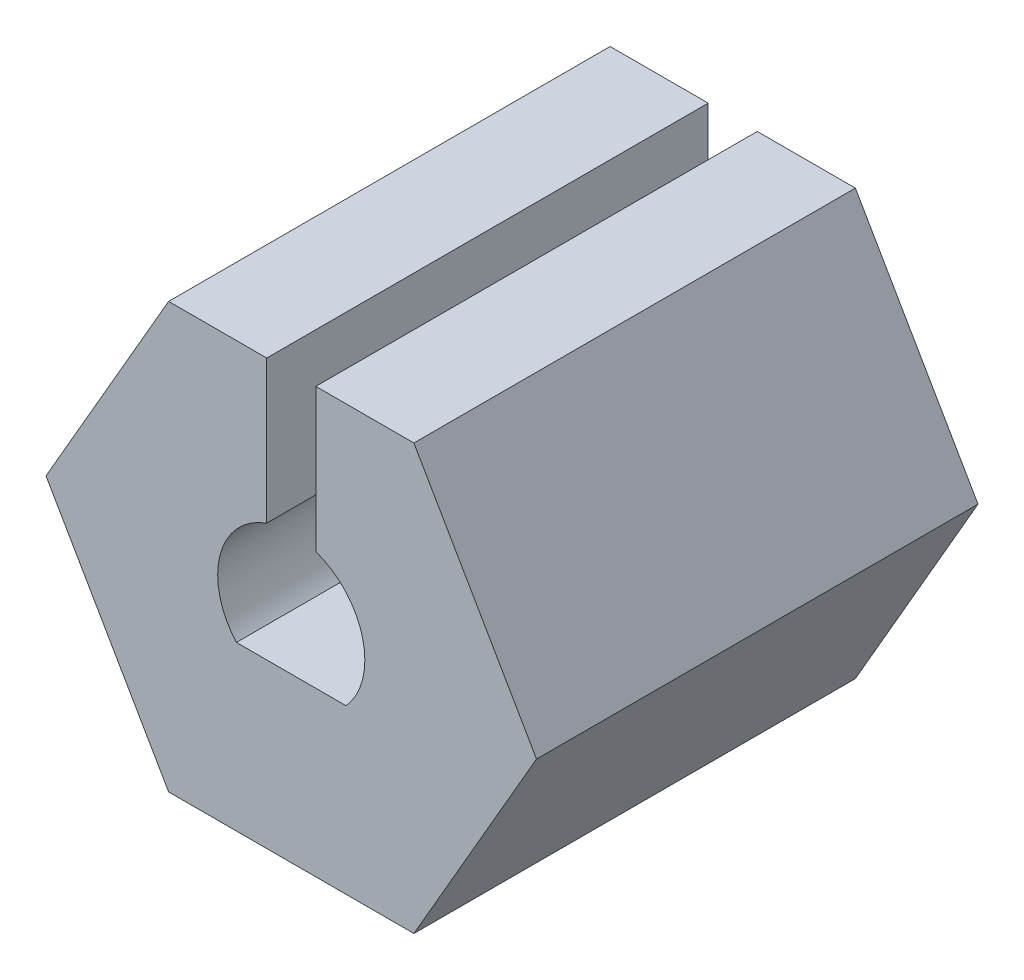
ISO-10303-21;
HEADER;
FILE_DESCRIPTION(('STEP AP214'),'2;1');
FILE_NAME('part.step','',(''),(''),'','','');
FILE_SCHEMA(('AUTOMOTIVE_DESIGN { 1 0 10303 214 1 1 1 1 }'));
ENDSEC;
DATA;
#1=APPLICATION_CONTEXT('core data for automotive mechanical design processes');
#2=APPLICATION_PROTOCOL_DEFINITION('international standard','automotive_design',2000,#1);
#3=PRODUCT_CONTEXT('',#1,'mechanical');
#4=PRODUCT('Part','Part','',(#3));
#5=PRODUCT_RELATED_PRODUCT_CATEGORY('part','',(#4));
#6=PRODUCT_DEFINITION_FORMATION('','',#4);
#7=PRODUCT_DEFINITION_CONTEXT('part definition',#1,'design');
#8=PRODUCT_DEFINITION('design','',#6,#7);
#9=PRODUCT_DEFINITION_SHAPE('','',#8);
#10=(LENGTH_UNIT() NAMED_UNIT(*) SI_UNIT(.MILLI.,.METRE.));
#11=(NAMED_UNIT(*) PLANE_ANGLE_UNIT() SI_UNIT($,.RADIAN.));
#12=(NAMED_UNIT(*) SI_UNIT($,.STERADIAN.) SOLID_ANGLE_UNIT());
#13=UNCERTAINTY_MEASURE_WITH_UNIT(LENGTH_MEASURE(1.E-05),#10,'distance_accuracy_value','');
#14=(GEOMETRIC_REPRESENTATION_CONTEXT(3) GLOBAL_UNCERTAINTY_ASSIGNED_CONTEXT((#13)) GLOBAL_UNIT_ASSIGNED_CONTEXT((#10,
#11,#12)) REPRESENTATION_CONTEXT('',''));
#15=CARTESIAN_POINT('',(0.,0.,0.));
#16=DIRECTION('',(0.,0.,1.));
#17=DIRECTION('',(1.,0.,0.));
#18=AXIS2_PLACEMENT_3D('',#15,#16,#17);
#19=CARTESIAN_POINT('',(0.,0.,9.));
#20=DIRECTION('',(0.,0.,-1.));
#21=DIRECTION('',(-1.,0.,0.));
#22=AXIS2_PLACEMENT_3D('',#19,#20,#21);
#23=CYLINDRICAL_SURFACE('',#22,1.5);
#24=CARTESIAN_POINT('',(0.,0.,0.));
#25=DIRECTION('',(0.,0.,1.));
#26=DIRECTION('',(1.,0.,0.));
#27=AXIS2_PLACEMENT_3D('',#24,#25,#26);
#28=CIRCLE('',#27,1.5);
#29=CARTESIAN_POINT('',(-0.499999999999999,1.4142135623731,0.));
#30=VERTEX_POINT('',#29);
#31=CARTESIAN_POINT('',(-1.1180339887499,-1.,0.));
#32=VERTEX_POINT('',#31);
#33=EDGE_CURVE('E162',#30,#32,#28,.T.);
#34=ORIENTED_EDGE('',*,*,#33,.F.);
#35=DIRECTION('',(0.,0.,-1.));
#36=VECTOR('',#35,1.);
#37=CARTESIAN_POINT('',(-0.499999999999999,1.4142135623731,9.));
#38=LINE('',#37,#36);
#39=CARTESIAN_POINT('',(-0.499999999999999,1.4142135623731,9.));
#40=VERTEX_POINT('',#39);
#41=EDGE_CURVE('E11',#40,#30,#38,.T.);
#42=ORIENTED_EDGE('',*,*,#41,.F.);
#43=CARTESIAN_POINT('',(0.,0.,9.));
#44=DIRECTION('',(0.,0.,1.));
#45=DIRECTION('',(1.,0.,0.));
#46=AXIS2_PLACEMENT_3D('',#43,#44,#45);
#47=CIRCLE('',#46,1.5);
#48=CARTESIAN_POINT('',(-1.1180339887499,-1.,9.));
#49=VERTEX_POINT('',#48);
#50=EDGE_CURVE('E150',#40,#49,#47,.T.);
#51=ORIENTED_EDGE('',*,*,#50,.T.);
#52=DIRECTION('',(0.,0.,-1.));
#53=VECTOR('',#52,1.);
#54=CARTESIAN_POINT('',(-1.1180339887499,-1.,9.));
#55=LINE('',#54,#53);
#56=EDGE_CURVE('E52',#49,#32,#55,.T.);
#57=ORIENTED_EDGE('',*,*,#56,.T.);
#58=EDGE_LOOP('',(#34,#42,#51,#57));
#59=FACE_BOUND('',#58,.T.);
#60=ADVANCED_FACE('F35',(#59),#23,.F.);
#61=CARTESIAN_POINT('',(-0.499999999999999,0.,9.));
#62=DIRECTION('',(1.,0.,0.));
#63=DIRECTION('',(0.,1.,0.));
#64=AXIS2_PLACEMENT_3D('',#61,#62,#63);
#65=PLANE('',#64);
#66=DIRECTION('',(0.,-1.,0.));
#67=VECTOR('',#66,1.);
#68=CARTESIAN_POINT('',(-0.499999999999999,0.,0.));
#69=LINE('',#68,#67);
#70=CARTESIAN_POINT('',(-0.5,4.33012701892219,0.));
#71=VERTEX_POINT('',#70);
#72=EDGE_CURVE('E198',#71,#30,#69,.T.);
#73=ORIENTED_EDGE('',*,*,#72,.F.);
#74=DIRECTION('',(0.,0.,-1.));
#75=VECTOR('',#74,1.);
#76=CARTESIAN_POINT('',(-0.5,4.33012701892219,9.));
#77=LINE('',#76,#75);
#78=CARTESIAN_POINT('',(-0.5,4.33012701892219,9.));
#79=VERTEX_POINT('',#78);
#80=EDGE_CURVE('E44',#79,#71,#77,.T.);
#81=ORIENTED_EDGE('',*,*,#80,.F.);
#82=DIRECTION('',(0.,-1.,0.));
#83=VECTOR('',#82,1.);
#84=CARTESIAN_POINT('',(-0.499999999999999,0.,9.));
#85=LINE('',#84,#83);
#86=EDGE_CURVE('E153',#79,#40,#85,.T.);
#87=ORIENTED_EDGE('',*,*,#86,.T.);
#88=ORIENTED_EDGE('',*,*,#41,.T.);
#89=EDGE_LOOP('',(#73,#81,#87,#88));
#90=FACE_BOUND('',#89,.T.);
#91=ADVANCED_FACE('F37',(#90),#65,.T.);
#92=CARTESIAN_POINT('',(0.,4.33012701892219,9.));
#93=DIRECTION('',(0.,-1.,0.));
#94=DIRECTION('',(1.,0.,0.));
#95=AXIS2_PLACEMENT_3D('',#92,#93,#94);
#96=PLANE('',#95);
#97=DIRECTION('',(-1.,0.,0.));
#98=VECTOR('',#97,1.);
#99=CARTESIAN_POINT('',(0.,4.33012701892219,0.));
#100=LINE('',#99,#98);
#101=CARTESIAN_POINT('',(-2.50000000000002,4.33012701892218,0.));
#102=VERTEX_POINT('',#101);
#103=EDGE_CURVE('E191',#71,#102,#100,.T.);
#104=ORIENTED_EDGE('',*,*,#103,.T.);
#105=DIRECTION('',(0.,0.,-1.));
#106=VECTOR('',#105,1.);
#107=CARTESIAN_POINT('',(-2.50000000000002,4.33012701892218,9.));
#108=LINE('',#107,#106);
#109=CARTESIAN_POINT('',(-2.50000000000002,4.33012701892218,9.));
#110=VERTEX_POINT('',#109);
#111=EDGE_CURVE('E184',#110,#102,#108,.T.);
#112=ORIENTED_EDGE('',*,*,#111,.F.);
#113=DIRECTION('',(-1.,0.,0.));
#114=VECTOR('',#113,1.);
#115=CARTESIAN_POINT('',(0.,4.33012701892219,9.));
#116=LINE('',#115,#114);
#117=EDGE_CURVE('E156',#79,#110,#116,.T.);
#118=ORIENTED_EDGE('',*,*,#117,.F.);
#119=ORIENTED_EDGE('',*,*,#80,.T.);
#120=EDGE_LOOP('',(#104,#112,#118,#119));
#121=FACE_BOUND('',#120,.T.);
#122=ADVANCED_FACE('F189',(#121),#96,.F.);
#123=CARTESIAN_POINT('',(-3.75000000000001,2.16506350946107,9.));
#124=DIRECTION('',(0.866025403784441,-0.499999999999995,0.));
#125=DIRECTION('',(0.499999999999995,0.866025403784442,0.));
#126=AXIS2_PLACEMENT_3D('',#123,#124,#125);
#127=PLANE('',#126);
#128=DIRECTION('',(-0.499999999999995,-0.866025403784442,0.));
#129=VECTOR('',#128,1.);
#130=CARTESIAN_POINT('',(-3.75000000000001,2.16506350946107,0.));
#131=LINE('',#130,#129);
#132=CARTESIAN_POINT('',(-5.,0.,0.));
#133=VERTEX_POINT('',#132);
#134=EDGE_CURVE('E200',#102,#133,#131,.T.);
#135=ORIENTED_EDGE('',*,*,#134,.T.);
#136=DIRECTION('',(0.,0.,-1.));
#137=VECTOR('',#136,1.);
#138=CARTESIAN_POINT('',(-5.,0.,9.));
#139=LINE('',#138,#137);
#140=CARTESIAN_POINT('',(-5.,0.,9.));
#141=VERTEX_POINT('',#140);
#142=EDGE_CURVE('E181',#141,#133,#139,.T.);
#143=ORIENTED_EDGE('',*,*,#142,.F.);
#144=DIRECTION('',(-0.499999999999995,-0.866025403784442,0.));
#145=VECTOR('',#144,1.);
#146=CARTESIAN_POINT('',(-3.75000000000001,2.16506350946107,9.));
#147=LINE('',#146,#145);
#148=EDGE_CURVE('E237',#110,#141,#147,.T.);
#149=ORIENTED_EDGE('',*,*,#148,.F.);
#150=ORIENTED_EDGE('',*,*,#111,.T.);
#151=EDGE_LOOP('',(#135,#143,#149,#150));
#152=FACE_BOUND('',#151,.T.);
#153=ADVANCED_FACE('F241',(#152),#127,.F.);
#154=CARTESIAN_POINT('',(-3.74999999999998,-2.16506350946113,9.));
#155=DIRECTION('',(0.866025403784435,0.500000000000007,0.));
#156=DIRECTION('',(-0.500000000000007,0.866025403784435,0.));
#157=AXIS2_PLACEMENT_3D('',#154,#155,#156);
#158=PLANE('',#157);
#159=DIRECTION('',(0.500000000000007,-0.866025403784435,0.));
#160=VECTOR('',#159,1.);
#161=CARTESIAN_POINT('',(-3.74999999999998,-2.16506350946113,0.));
#162=LINE('',#161,#160);
#163=CARTESIAN_POINT('',(-2.49999999999996,-4.33012701892222,0.));
#164=VERTEX_POINT('',#163);
#165=EDGE_CURVE('E206',#133,#164,#162,.T.);
#166=ORIENTED_EDGE('',*,*,#165,.T.);
#167=DIRECTION('',(0.,0.,-1.));
#168=VECTOR('',#167,1.);
#169=CARTESIAN_POINT('',(-2.49999999999996,-4.33012701892222,9.));
#170=LINE('',#169,#168);
#171=CARTESIAN_POINT('',(-2.49999999999996,-4.33012701892222,9.));
#172=VERTEX_POINT('',#171);
#173=EDGE_CURVE('E178',#172,#164,#170,.T.);
#174=ORIENTED_EDGE('',*,*,#173,.F.);
#175=DIRECTION('',(0.500000000000007,-0.866025403784435,0.));
#176=VECTOR('',#175,1.);
#177=CARTESIAN_POINT('',(-3.74999999999998,-2.16506350946113,9.));
#178=LINE('',#177,#176);
#179=EDGE_CURVE('E235',#141,#172,#178,.T.);
#180=ORIENTED_EDGE('',*,*,#179,.F.);
#181=ORIENTED_EDGE('',*,*,#142,.T.);
#182=EDGE_LOOP('',(#166,#174,#180,#181));
#183=FACE_BOUND('',#182,.T.);
#184=ADVANCED_FACE('F245',(#183),#158,.F.);
#185=CARTESIAN_POINT('',(0.,-4.33012701892219,9.));
#186=DIRECTION('',(0.,1.,0.));
#187=DIRECTION('',(-1.,0.,0.));
#188=AXIS2_PLACEMENT_3D('',#185,#186,#187);
#189=PLANE('',#188);
#190=DIRECTION('',(1.,0.,0.));
#191=VECTOR('',#190,1.);
#192=CARTESIAN_POINT('',(0.,-4.33012701892219,0.));
#193=LINE('',#192,#191);
#194=CARTESIAN_POINT('',(2.50000000000005,-4.33012701892216,0.));
#195=VERTEX_POINT('',#194);
#196=EDGE_CURVE('E208',#164,#195,#193,.T.);
#197=ORIENTED_EDGE('',*,*,#196,.T.);
#198=DIRECTION('',(0.,0.,-1.));
#199=VECTOR('',#198,1.);
#200=CARTESIAN_POINT('',(2.50000000000005,-4.33012701892216,9.));
#201=LINE('',#200,#199);
#202=CARTESIAN_POINT('',(2.50000000000005,-4.33012701892216,9.));
#203=VERTEX_POINT('',#202);
#204=EDGE_CURVE('E175',#203,#195,#201,.T.);
#205=ORIENTED_EDGE('',*,*,#204,.F.);
#206=DIRECTION('',(1.,0.,0.));
#207=VECTOR('',#206,1.);
#208=CARTESIAN_POINT('',(0.,-4.33012701892219,9.));
#209=LINE('',#208,#207);
#210=EDGE_CURVE('E231',#172,#203,#209,.T.);
#211=ORIENTED_EDGE('',*,*,#210,.F.);
#212=ORIENTED_EDGE('',*,*,#173,.T.);
#213=EDGE_LOOP('',(#197,#205,#211,#212));
#214=FACE_BOUND('',#213,.T.);
#215=ADVANCED_FACE('F248',(#214),#189,.F.);
#216=CARTESIAN_POINT('',(3.75000000000003,-2.16506350946108,9.));
#217=DIRECTION('',(-0.866025403784442,0.499999999999995,0.));
#218=DIRECTION('',(-0.499999999999995,-0.866025403784442,0.));
#219=AXIS2_PLACEMENT_3D('',#216,#217,#218);
#220=PLANE('',#219);
#221=DIRECTION('',(0.499999999999995,0.866025403784442,0.));
#222=VECTOR('',#221,1.);
#223=CARTESIAN_POINT('',(3.75000000000003,-2.16506350946108,0.));
#224=LINE('',#223,#222);
#225=CARTESIAN_POINT('',(5.,0.,0.));
#226=VERTEX_POINT('',#225);
#227=EDGE_CURVE('E210',#195,#226,#224,.T.);
#228=ORIENTED_EDGE('',*,*,#227,.T.);
#229=DIRECTION('',(0.,0.,-1.));
#230=VECTOR('',#229,1.);
#231=CARTESIAN_POINT('',(5.,0.,9.));
#232=LINE('',#231,#230);
#233=CARTESIAN_POINT('',(5.,0.,9.));
#234=VERTEX_POINT('',#233);
#235=EDGE_CURVE('E172',#234,#226,#232,.T.);
#236=ORIENTED_EDGE('',*,*,#235,.F.);
#237=DIRECTION('',(0.499999999999995,0.866025403784442,0.));
#238=VECTOR('',#237,1.);
#239=CARTESIAN_POINT('',(3.75000000000003,-2.16506350946108,9.));
#240=LINE('',#239,#238);
#241=EDGE_CURVE('E228',#203,#234,#240,.T.);
#242=ORIENTED_EDGE('',*,*,#241,.F.);
#243=ORIENTED_EDGE('',*,*,#204,.T.);
#244=EDGE_LOOP('',(#228,#236,#242,#243));
#245=FACE_BOUND('',#244,.T.);
#246=ADVANCED_FACE('F222',(#245),#220,.F.);
#247=CARTESIAN_POINT('',(3.75,2.1650635094611,9.));
#248=DIRECTION('',(-0.866025403784438,-0.500000000000001,0.));
#249=DIRECTION('',(0.500000000000001,-0.866025403784438,0.));
#250=AXIS2_PLACEMENT_3D('',#247,#248,#249);
#251=PLANE('',#250);
#252=DIRECTION('',(-0.500000000000001,0.866025403784438,0.));
#253=VECTOR('',#252,1.);
#254=CARTESIAN_POINT('',(3.75,2.1650635094611,0.));
#255=LINE('',#254,#253);
#256=CARTESIAN_POINT('',(2.49999999999999,4.3301270189222,0.));
#257=VERTEX_POINT('',#256);
#258=EDGE_CURVE('E211',#226,#257,#255,.T.);
#259=ORIENTED_EDGE('',*,*,#258,.T.);
#260=DIRECTION('',(0.,0.,-1.));
#261=VECTOR('',#260,1.);
#262=CARTESIAN_POINT('',(2.49999999999999,4.3301270189222,9.));
#263=LINE('',#262,#261);
#264=CARTESIAN_POINT('',(2.49999999999999,4.3301270189222,9.));
#265=VERTEX_POINT('',#264);
#266=EDGE_CURVE('E169',#265,#257,#263,.T.);
#267=ORIENTED_EDGE('',*,*,#266,.F.);
#268=DIRECTION('',(-0.500000000000001,0.866025403784438,0.));
#269=VECTOR('',#268,1.);
#270=CARTESIAN_POINT('',(3.75,2.1650635094611,9.));
#271=LINE('',#270,#269);
#272=EDGE_CURVE('E227',#234,#265,#271,.T.);
#273=ORIENTED_EDGE('',*,*,#272,.F.);
#274=ORIENTED_EDGE('',*,*,#235,.T.);
#275=EDGE_LOOP('',(#259,#267,#273,#274));
#276=FACE_BOUND('',#275,.T.);
#277=ADVANCED_FACE('F226',(#276),#251,.F.);
#278=CARTESIAN_POINT('',(0.5,4.33012701892219,0.));
#279=VERTEX_POINT('',#278);
#280=EDGE_CURVE('E202',#257,#279,#100,.T.);
#281=ORIENTED_EDGE('',*,*,#280,.T.);
#282=DIRECTION('',(0.,0.,-1.));
#283=VECTOR('',#282,1.);
#284=CARTESIAN_POINT('',(0.5,4.33012701892219,9.));
#285=LINE('',#284,#283);
#286=CARTESIAN_POINT('',(0.5,4.33012701892219,9.));
#287=VERTEX_POINT('',#286);
#288=EDGE_CURVE('E145',#287,#279,#285,.T.);
#289=ORIENTED_EDGE('',*,*,#288,.F.);
#290=EDGE_CURVE('E133',#265,#287,#116,.T.);
#291=ORIENTED_EDGE('',*,*,#290,.F.);
#292=ORIENTED_EDGE('',*,*,#266,.T.);
#293=EDGE_LOOP('',(#281,#289,#291,#292));
#294=FACE_BOUND('',#293,.T.);
#295=ADVANCED_FACE('F217',(#294),#96,.F.);
#296=CARTESIAN_POINT('',(0.500000000000001,0.,9.));
#297=DIRECTION('',(1.,0.,0.));
#298=DIRECTION('',(0.,1.,0.));
#299=AXIS2_PLACEMENT_3D('',#296,#297,#298);
#300=PLANE('',#299);
#301=DIRECTION('',(0.,-1.,0.));
#302=VECTOR('',#301,1.);
#303=CARTESIAN_POINT('',(0.500000000000001,0.,0.));
#304=LINE('',#303,#302);
#305=CARTESIAN_POINT('',(0.5,1.4142135623731,0.));
#306=VERTEX_POINT('',#305);
#307=EDGE_CURVE('E142',#279,#306,#304,.T.);
#308=ORIENTED_EDGE('',*,*,#307,.T.);
#309=DIRECTION('',(0.,0.,-1.));
#310=VECTOR('',#309,1.);
#311=CARTESIAN_POINT('',(0.5,1.4142135623731,9.));
#312=LINE('',#311,#310);
#313=CARTESIAN_POINT('',(0.5,1.4142135623731,9.));
#314=VERTEX_POINT('',#313);
#315=EDGE_CURVE('E139',#314,#306,#312,.T.);
#316=ORIENTED_EDGE('',*,*,#315,.F.);
#317=DIRECTION('',(0.,-1.,0.));
#318=VECTOR('',#317,1.);
#319=CARTESIAN_POINT('',(0.500000000000001,0.,9.));
#320=LINE('',#319,#318);
#321=EDGE_CURVE('E126',#287,#314,#320,.T.);
#322=ORIENTED_EDGE('',*,*,#321,.F.);
#323=ORIENTED_EDGE('',*,*,#288,.T.);
#324=EDGE_LOOP('',(#308,#316,#322,#323));
#325=FACE_BOUND('',#324,.T.);
#326=ADVANCED_FACE('F140',(#325),#300,.F.);
#327=CARTESIAN_POINT('',(1.1180339887499,-1.,0.));
#328=VERTEX_POINT('',#327);
#329=EDGE_CURVE('E158',#328,#306,#28,.T.);
#330=ORIENTED_EDGE('',*,*,#329,.F.);
#331=DIRECTION('',(0.,0.,-1.));
#332=VECTOR('',#331,1.);
#333=CARTESIAN_POINT('',(1.1180339887499,-1.,9.));
#334=LINE('',#333,#332);
#335=CARTESIAN_POINT('',(1.1180339887499,-1.,9.));
#336=VERTEX_POINT('',#335);
#337=EDGE_CURVE('E89',#336,#328,#334,.T.);
#338=ORIENTED_EDGE('',*,*,#337,.F.);
#339=EDGE_CURVE('E131',#336,#314,#47,.T.);
#340=ORIENTED_EDGE('',*,*,#339,.T.);
#341=ORIENTED_EDGE('',*,*,#315,.T.);
#342=EDGE_LOOP('',(#330,#338,#340,#341));
#343=FACE_BOUND('',#342,.T.);
#344=ADVANCED_FACE('F147',(#343),#23,.F.);
#345=CARTESIAN_POINT('',(0.,-1.,9.));
#346=DIRECTION('',(0.,1.,0.));
#347=DIRECTION('',(0.,0.,1.));
#348=AXIS2_PLACEMENT_3D('',#345,#346,#347);
#349=PLANE('',#348);
#350=DIRECTION('',(1.,0.,0.));
#351=VECTOR('',#350,1.);
#352=CARTESIAN_POINT('',(0.,-1.,0.));
#353=LINE('',#352,#351);
#354=EDGE_CURVE('E154',#32,#328,#353,.T.);
#355=ORIENTED_EDGE('',*,*,#354,.F.);
#356=ORIENTED_EDGE('',*,*,#56,.F.);
#357=DIRECTION('',(1.,0.,0.));
#358=VECTOR('',#357,1.);
#359=CARTESIAN_POINT('',(0.,-1.,9.));
#360=LINE('',#359,#358);
#361=EDGE_CURVE('E148',#49,#336,#360,.T.);
#362=ORIENTED_EDGE('',*,*,#361,.T.);
#363=ORIENTED_EDGE('',*,*,#337,.T.);
#364=EDGE_LOOP('',(#355,#356,#362,#363));
#365=FACE_BOUND('',#364,.T.);
#366=ADVANCED_FACE('F265',(#365),#349,.T.);
#367=CARTESIAN_POINT('',(0.,0.,9.));
#368=DIRECTION('',(0.,0.,1.));
#369=DIRECTION('',(1.,0.,0.));
#370=AXIS2_PLACEMENT_3D('',#367,#368,#369);
#371=PLANE('',#370);
#372=ORIENTED_EDGE('',*,*,#50,.F.);
#373=ORIENTED_EDGE('',*,*,#86,.F.);
#374=ORIENTED_EDGE('',*,*,#117,.T.);
#375=ORIENTED_EDGE('',*,*,#148,.T.);
#376=ORIENTED_EDGE('',*,*,#179,.T.);
#377=ORIENTED_EDGE('',*,*,#210,.T.);
#378=ORIENTED_EDGE('',*,*,#241,.T.);
#379=ORIENTED_EDGE('',*,*,#272,.T.);
#380=ORIENTED_EDGE('',*,*,#290,.T.);
#381=ORIENTED_EDGE('',*,*,#321,.T.);
#382=ORIENTED_EDGE('',*,*,#339,.F.);
#383=ORIENTED_EDGE('',*,*,#361,.F.);
#384=EDGE_LOOP('',(#372,#373,#374,#375,#376,#377,#378,#379,#380,#381,#382,#383));
#385=FACE_BOUND('',#384,.T.);
#386=ADVANCED_FACE('F128',(#385),#371,.T.);
#387=CARTESIAN_POINT('',(0.,0.,0.));
#388=DIRECTION('',(0.,0.,1.));
#389=DIRECTION('',(1.,0.,0.));
#390=AXIS2_PLACEMENT_3D('',#387,#388,#389);
#391=PLANE('',#390);
#392=ORIENTED_EDGE('',*,*,#33,.T.);
#393=ORIENTED_EDGE('',*,*,#354,.T.);
#394=ORIENTED_EDGE('',*,*,#329,.T.);
#395=ORIENTED_EDGE('',*,*,#307,.F.);
#396=ORIENTED_EDGE('',*,*,#280,.F.);
#397=ORIENTED_EDGE('',*,*,#258,.F.);
#398=ORIENTED_EDGE('',*,*,#227,.F.);
#399=ORIENTED_EDGE('',*,*,#196,.F.);
#400=ORIENTED_EDGE('',*,*,#165,.F.);
#401=ORIENTED_EDGE('',*,*,#134,.F.);
#402=ORIENTED_EDGE('',*,*,#103,.F.);
#403=ORIENTED_EDGE('',*,*,#72,.T.);
#404=EDGE_LOOP('',(#392,#393,#394,#395,#396,#397,#398,#399,#400,#401,#402,#403));
#405=FACE_BOUND('',#404,.T.);
#406=ADVANCED_FACE('F197',(#405),#391,.F.);
#407=CLOSED_SHELL('',(#60,#91,#122,#153,#184,#215,#246,#277,#295,#326,#344,#366,#386,#406));
#408=MANIFOLD_SOLID_BREP('B2',#407);
#409=ADVANCED_BREP_SHAPE_REPRESENTATION('',(#18,#408),#14);
#410=SHAPE_DEFINITION_REPRESENTATION(#9,#409);
ENDSEC;
END-ISO-10303-21;
